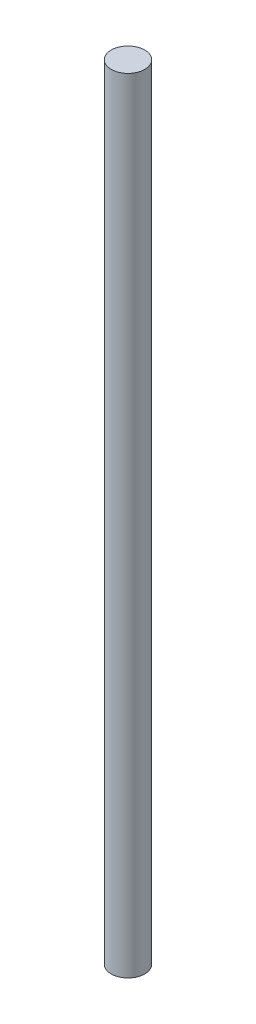
ISO-10303-21;
HEADER;
FILE_DESCRIPTION(('STEP AP214'),'2;1');
FILE_NAME('part.step','',(''),(''),'','','');
FILE_SCHEMA(('AUTOMOTIVE_DESIGN { 1 0 10303 214 1 1 1 1 }'));
ENDSEC;
DATA;
#1=APPLICATION_CONTEXT('core data for automotive mechanical design processes');
#2=APPLICATION_PROTOCOL_DEFINITION('international standard','automotive_design',2000,#1);
#3=PRODUCT_CONTEXT('',#1,'mechanical');
#4=PRODUCT('Part','Part','',(#3));
#5=PRODUCT_RELATED_PRODUCT_CATEGORY('part','',(#4));
#6=PRODUCT_DEFINITION_FORMATION('','',#4);
#7=PRODUCT_DEFINITION_CONTEXT('part definition',#1,'design');
#8=PRODUCT_DEFINITION('design','',#6,#7);
#9=PRODUCT_DEFINITION_SHAPE('','',#8);
#10=(LENGTH_UNIT() NAMED_UNIT(*) SI_UNIT(.MILLI.,.METRE.));
#11=(NAMED_UNIT(*) PLANE_ANGLE_UNIT() SI_UNIT($,.RADIAN.));
#12=(NAMED_UNIT(*) SI_UNIT($,.STERADIAN.) SOLID_ANGLE_UNIT());
#13=UNCERTAINTY_MEASURE_WITH_UNIT(LENGTH_MEASURE(1.E-05),#10,'distance_accuracy_value','');
#14=(GEOMETRIC_REPRESENTATION_CONTEXT(3) GLOBAL_UNCERTAINTY_ASSIGNED_CONTEXT((#13)) GLOBAL_UNIT_ASSIGNED_CONTEXT((#10,
#11,#12)) REPRESENTATION_CONTEXT('',''));
#15=CARTESIAN_POINT('',(0.,0.,0.));
#16=DIRECTION('',(0.,0.,1.));
#17=DIRECTION('',(1.,0.,0.));
#18=AXIS2_PLACEMENT_3D('',#15,#16,#17);
#19=CARTESIAN_POINT('',(0.,140.,0.));
#20=DIRECTION('',(0.,-1.,0.));
#21=DIRECTION('',(0.,0.,-1.));
#22=AXIS2_PLACEMENT_3D('',#19,#20,#21);
#23=CYLINDRICAL_SURFACE('',#22,3.);
#24=CARTESIAN_POINT('',(0.,140.,0.));
#25=DIRECTION('',(0.,1.,0.));
#26=DIRECTION('',(0.,0.,1.));
#27=AXIS2_PLACEMENT_3D('',#24,#25,#26);
#28=CIRCLE('',#27,3.);
#29=CARTESIAN_POINT('',(0.,140.,3.));
#30=VERTEX_POINT('',#29);
#31=EDGE_CURVE('E10',#30,#30,#28,.T.);
#32=ORIENTED_EDGE('',*,*,#31,.F.);
#33=EDGE_LOOP('',(#32));
#34=FACE_BOUND('',#33,.T.);
#35=CARTESIAN_POINT('',(0.,0.,0.));
#36=DIRECTION('',(0.,1.,0.));
#37=DIRECTION('',(0.,0.,1.));
#38=AXIS2_PLACEMENT_3D('',#35,#36,#37);
#39=CIRCLE('',#38,3.);
#40=CARTESIAN_POINT('',(0.,0.,3.));
#41=VERTEX_POINT('',#40);
#42=EDGE_CURVE('E40',#41,#41,#39,.T.);
#43=ORIENTED_EDGE('',*,*,#42,.T.);
#44=EDGE_LOOP('',(#43));
#45=FACE_BOUND('',#44,.T.);
#46=ADVANCED_FACE('F37',(#34,#45),#23,.T.);
#47=CARTESIAN_POINT('',(0.,140.,0.));
#48=DIRECTION('',(0.,1.,0.));
#49=DIRECTION('',(0.,0.,1.));
#50=AXIS2_PLACEMENT_3D('',#47,#48,#49);
#51=PLANE('',#50);
#52=ORIENTED_EDGE('',*,*,#31,.T.);
#53=EDGE_LOOP('',(#52));
#54=FACE_BOUND('',#53,.T.);
#55=ADVANCED_FACE('F54',(#54),#51,.T.);
#56=CARTESIAN_POINT('',(0.,0.,0.));
#57=DIRECTION('',(0.,1.,0.));
#58=DIRECTION('',(0.,0.,1.));
#59=AXIS2_PLACEMENT_3D('',#56,#57,#58);
#60=PLANE('',#59);
#61=ORIENTED_EDGE('',*,*,#42,.F.);
#62=EDGE_LOOP('',(#61));
#63=FACE_BOUND('',#62,.T.);
#64=ADVANCED_FACE('F52',(#63),#60,.F.);
#65=CLOSED_SHELL('',(#46,#55,#64));
#66=MANIFOLD_SOLID_BREP('B2',#65);
#67=ADVANCED_BREP_SHAPE_REPRESENTATION('',(#18,#66),#14);
#68=SHAPE_DEFINITION_REPRESENTATION(#9,#67);
ENDSEC;
END-ISO-10303-21;
